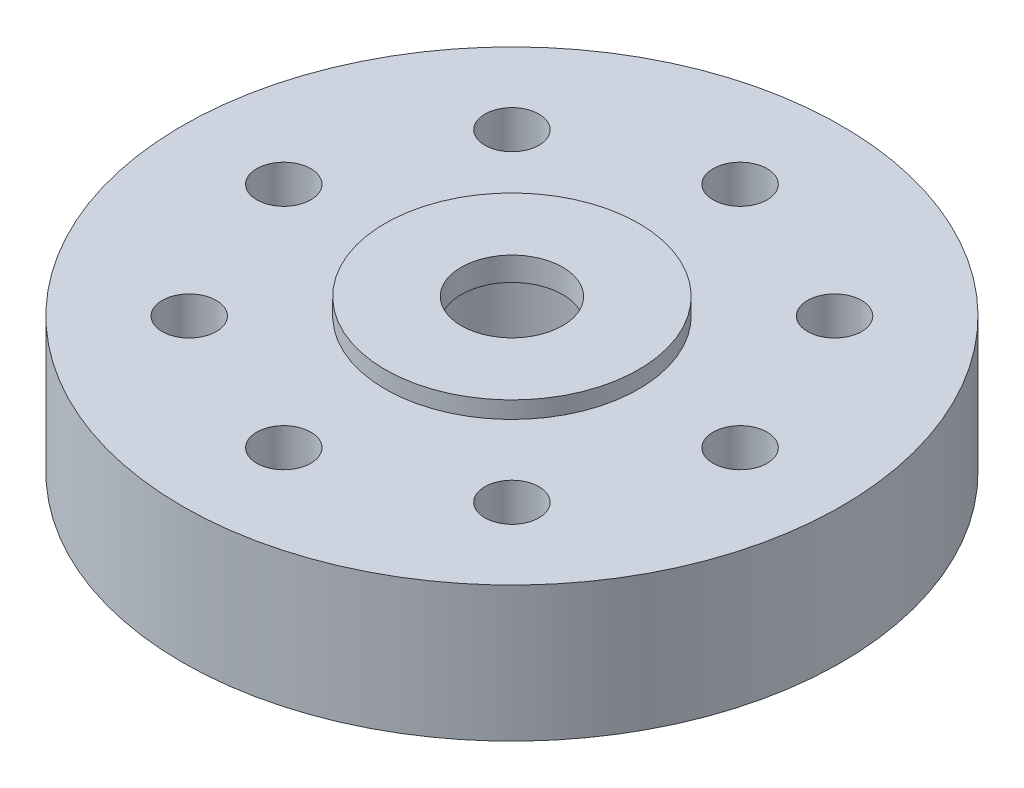
ISO-10303-21;
HEADER;
FILE_DESCRIPTION(('STEP AP214'),'2;1');
FILE_NAME('part.step','',(''),(''),'','','');
FILE_SCHEMA(('AUTOMOTIVE_DESIGN { 1 0 10303 214 1 1 1 1 }'));
ENDSEC;
DATA;
#1=APPLICATION_CONTEXT('core data for automotive mechanical design processes');
#2=APPLICATION_PROTOCOL_DEFINITION('international standard','automotive_design',2000,#1);
#3=PRODUCT_CONTEXT('',#1,'mechanical');
#4=PRODUCT('Part','Part','',(#3));
#5=PRODUCT_RELATED_PRODUCT_CATEGORY('part','',(#4));
#6=PRODUCT_DEFINITION_FORMATION('','',#4);
#7=PRODUCT_DEFINITION_CONTEXT('part definition',#1,'design');
#8=PRODUCT_DEFINITION('design','',#6,#7);
#9=PRODUCT_DEFINITION_SHAPE('','',#8);
#10=(LENGTH_UNIT() NAMED_UNIT(*) SI_UNIT(.MILLI.,.METRE.));
#11=(NAMED_UNIT(*) PLANE_ANGLE_UNIT() SI_UNIT($,.RADIAN.));
#12=(NAMED_UNIT(*) SI_UNIT($,.STERADIAN.) SOLID_ANGLE_UNIT());
#13=UNCERTAINTY_MEASURE_WITH_UNIT(LENGTH_MEASURE(1.E-05),#10,'distance_accuracy_value','');
#14=(GEOMETRIC_REPRESENTATION_CONTEXT(3) GLOBAL_UNCERTAINTY_ASSIGNED_CONTEXT((#13)) GLOBAL_UNIT_ASSIGNED_CONTEXT((#10,
#11,#12)) REPRESENTATION_CONTEXT('',''));
#15=CARTESIAN_POINT('',(0.,0.,0.));
#16=DIRECTION('',(0.,0.,1.));
#17=DIRECTION('',(1.,0.,0.));
#18=AXIS2_PLACEMENT_3D('',#15,#16,#17);
#19=CARTESIAN_POINT('',(0.,2.,0.));
#20=DIRECTION('',(0.,-1.,0.));
#21=DIRECTION('',(0.,0.,-1.));
#22=AXIS2_PLACEMENT_3D('',#19,#20,#21);
#23=CYLINDRICAL_SURFACE('',#22,1.5);
#24=CARTESIAN_POINT('',(0.,2.5,0.));
#25=DIRECTION('',(0.,1.,0.));
#26=DIRECTION('',(0.,0.,1.));
#27=AXIS2_PLACEMENT_3D('',#24,#25,#26);
#28=CIRCLE('',#27,1.5);
#29=CARTESIAN_POINT('',(0.,2.5,1.5));
#30=VERTEX_POINT('',#29);
#31=EDGE_CURVE('E252',#30,#30,#28,.T.);
#32=ORIENTED_EDGE('',*,*,#31,.T.);
#33=EDGE_LOOP('',(#32));
#34=FACE_BOUND('',#33,.T.);
#35=CARTESIAN_POINT('',(0.,1.8,0.));
#36=DIRECTION('',(0.,-1.,0.));
#37=DIRECTION('',(0.,0.,-1.));
#38=AXIS2_PLACEMENT_3D('',#35,#36,#37);
#39=CIRCLE('',#38,1.5);
#40=CARTESIAN_POINT('',(0.,1.8,-1.5));
#41=VERTEX_POINT('',#40);
#42=EDGE_CURVE('E333',#41,#41,#39,.T.);
#43=ORIENTED_EDGE('',*,*,#42,.T.);
#44=EDGE_LOOP('',(#43));
#45=FACE_BOUND('',#44,.T.);
#46=ADVANCED_FACE('F38',(#34,#45),#23,.F.);
#47=CARTESIAN_POINT('',(0.,-2.,0.));
#48=DIRECTION('',(0.,1.,0.));
#49=DIRECTION('',(0.,0.,1.));
#50=AXIS2_PLACEMENT_3D('',#47,#48,#49);
#51=PLANE('',#50);
#52=CARTESIAN_POINT('',(0.,-2.,0.));
#53=DIRECTION('',(0.,1.,0.));
#54=DIRECTION('',(0.,0.,1.));
#55=AXIS2_PLACEMENT_3D('',#52,#53,#54);
#56=CIRCLE('',#55,9.75);
#57=CARTESIAN_POINT('',(0.,-2.,9.75));
#58=VERTEX_POINT('',#57);
#59=EDGE_CURVE('E289',#58,#58,#56,.T.);
#60=ORIENTED_EDGE('',*,*,#59,.F.);
#61=EDGE_LOOP('',(#60));
#62=FACE_BOUND('',#61,.T.);
#63=CARTESIAN_POINT('',(6.75,-2.,0.));
#64=DIRECTION('',(0.,1.,0.));
#65=DIRECTION('',(0.,0.,1.));
#66=AXIS2_PLACEMENT_3D('',#63,#64,#65);
#67=CIRCLE('',#66,0.800000000000001);
#68=CARTESIAN_POINT('',(6.75,-2.,0.800000000000001));
#69=VERTEX_POINT('',#68);
#70=EDGE_CURVE('E329',#69,#69,#67,.T.);
#71=ORIENTED_EDGE('',*,*,#70,.T.);
#72=EDGE_LOOP('',(#71));
#73=FACE_BOUND('',#72,.T.);
#74=CARTESIAN_POINT('',(0.,-2.,6.75));
#75=DIRECTION('',(0.,1.,0.));
#76=DIRECTION('',(0.,0.,1.));
#77=AXIS2_PLACEMENT_3D('',#74,#75,#76);
#78=CIRCLE('',#77,0.8);
#79=CARTESIAN_POINT('',(0.,-2.,7.55));
#80=VERTEX_POINT('',#79);
#81=EDGE_CURVE('E326',#80,#80,#78,.T.);
#82=ORIENTED_EDGE('',*,*,#81,.T.);
#83=EDGE_LOOP('',(#82));
#84=FACE_BOUND('',#83,.T.);
#85=CARTESIAN_POINT('',(-6.75,-2.,0.));
#86=DIRECTION('',(0.,1.,0.));
#87=DIRECTION('',(0.,0.,1.));
#88=AXIS2_PLACEMENT_3D('',#85,#86,#87);
#89=CIRCLE('',#88,0.800000000000001);
#90=CARTESIAN_POINT('',(-6.75,-2.,0.800000000000001));
#91=VERTEX_POINT('',#90);
#92=EDGE_CURVE('E323',#91,#91,#89,.T.);
#93=ORIENTED_EDGE('',*,*,#92,.T.);
#94=EDGE_LOOP('',(#93));
#95=FACE_BOUND('',#94,.T.);
#96=CARTESIAN_POINT('',(0.,-2.,-6.75));
#97=DIRECTION('',(0.,1.,0.));
#98=DIRECTION('',(0.,0.,1.));
#99=AXIS2_PLACEMENT_3D('',#96,#97,#98);
#100=CIRCLE('',#99,0.8);
#101=CARTESIAN_POINT('',(0.,-2.,-5.95));
#102=VERTEX_POINT('',#101);
#103=EDGE_CURVE('E320',#102,#102,#100,.T.);
#104=ORIENTED_EDGE('',*,*,#103,.T.);
#105=EDGE_LOOP('',(#104));
#106=FACE_BOUND('',#105,.T.);
#107=CARTESIAN_POINT('',(4.7729707730092,-2.,4.7729707730092));
#108=DIRECTION('',(0.,1.,0.));
#109=DIRECTION('',(0.,0.,1.));
#110=AXIS2_PLACEMENT_3D('',#107,#108,#109);
#111=CIRCLE('',#110,0.800000000000001);
#112=CARTESIAN_POINT('',(4.7729707730092,-2.,5.5729707730092));
#113=VERTEX_POINT('',#112);
#114=EDGE_CURVE('E317',#113,#113,#111,.T.);
#115=ORIENTED_EDGE('',*,*,#114,.T.);
#116=EDGE_LOOP('',(#115));
#117=FACE_BOUND('',#116,.T.);
#118=CARTESIAN_POINT('',(-4.7729707730092,-2.,4.7729707730092));
#119=DIRECTION('',(0.,1.,0.));
#120=DIRECTION('',(0.,0.,1.));
#121=AXIS2_PLACEMENT_3D('',#118,#119,#120);
#122=CIRCLE('',#121,0.8);
#123=CARTESIAN_POINT('',(-4.7729707730092,-2.,5.5729707730092));
#124=VERTEX_POINT('',#123);
#125=EDGE_CURVE('E314',#124,#124,#122,.T.);
#126=ORIENTED_EDGE('',*,*,#125,.T.);
#127=EDGE_LOOP('',(#126));
#128=FACE_BOUND('',#127,.T.);
#129=CARTESIAN_POINT('',(-4.7729707730092,-2.,-4.7729707730092));
#130=DIRECTION('',(0.,1.,0.));
#131=DIRECTION('',(0.,0.,1.));
#132=AXIS2_PLACEMENT_3D('',#129,#130,#131);
#133=CIRCLE('',#132,0.8);
#134=CARTESIAN_POINT('',(-4.7729707730092,-2.,-3.97297077300919));
#135=VERTEX_POINT('',#134);
#136=EDGE_CURVE('E311',#135,#135,#133,.T.);
#137=ORIENTED_EDGE('',*,*,#136,.T.);
#138=EDGE_LOOP('',(#137));
#139=FACE_BOUND('',#138,.T.);
#140=CARTESIAN_POINT('',(4.77297077300919,-2.,-4.7729707730092));
#141=DIRECTION('',(0.,1.,0.));
#142=DIRECTION('',(0.,0.,1.));
#143=AXIS2_PLACEMENT_3D('',#140,#141,#142);
#144=CIRCLE('',#143,0.800000000000001);
#145=CARTESIAN_POINT('',(4.77297077300919,-2.,-3.9729707730092));
#146=VERTEX_POINT('',#145);
#147=EDGE_CURVE('E284',#146,#146,#144,.T.);
#148=ORIENTED_EDGE('',*,*,#147,.T.);
#149=EDGE_LOOP('',(#148));
#150=FACE_BOUND('',#149,.T.);
#151=CARTESIAN_POINT('',(4.77297077300919,-2.,4.7729707730092));
#152=DIRECTION('',(0.,-1.,0.));
#153=DIRECTION('',(0.,0.,-1.));
#154=AXIS2_PLACEMENT_3D('',#151,#152,#153);
#155=CIRCLE('',#154,2.);
#156=CARTESIAN_POINT('',(5.31331654942509,-2.,6.69859442313128));
#157=VERTEX_POINT('',#156);
#158=CARTESIAN_POINT('',(6.69859442313128,-2.,5.31331654942509));
#159=VERTEX_POINT('',#158);
#160=EDGE_CURVE('E55',#157,#159,#155,.T.);
#161=ORIENTED_EDGE('',*,*,#160,.T.);
#162=CARTESIAN_POINT('',(0.,-2.,0.));
#163=DIRECTION('',(0.,-1.,0.));
#164=DIRECTION('',(0.,0.,-1.));
#165=AXIS2_PLACEMENT_3D('',#162,#163,#164);
#166=CIRCLE('',#165,8.55);
#167=CARTESIAN_POINT('',(8.49370370370371,-2.,0.979539378325329));
#168=VERTEX_POINT('',#167);
#169=EDGE_CURVE('E226',#168,#159,#166,.T.);
#170=ORIENTED_EDGE('',*,*,#169,.F.);
#171=CARTESIAN_POINT('',(6.75,-2.,0.));
#172=DIRECTION('',(0.,-1.,0.));
#173=DIRECTION('',(0.,0.,-1.));
#174=AXIS2_PLACEMENT_3D('',#171,#172,#173);
#175=CIRCLE('',#174,2.);
#176=CARTESIAN_POINT('',(8.49370370370371,-2.,-0.979539378325329));
#177=VERTEX_POINT('',#176);
#178=EDGE_CURVE('E249',#168,#177,#175,.T.);
#179=ORIENTED_EDGE('',*,*,#178,.T.);
#180=CARTESIAN_POINT('',(6.69859442313128,-2.,-5.31331654942509));
#181=VERTEX_POINT('',#180);
#182=EDGE_CURVE('E172',#181,#177,#166,.T.);
#183=ORIENTED_EDGE('',*,*,#182,.F.);
#184=CARTESIAN_POINT('',(4.7729707730092,-2.,-4.7729707730092));
#185=DIRECTION('',(0.,-1.,0.));
#186=DIRECTION('',(0.,0.,-1.));
#187=AXIS2_PLACEMENT_3D('',#184,#185,#186);
#188=CIRCLE('',#187,2.);
#189=CARTESIAN_POINT('',(5.31331654942509,-2.,-6.69859442313128));
#190=VERTEX_POINT('',#189);
#191=EDGE_CURVE('E246',#181,#190,#188,.T.);
#192=ORIENTED_EDGE('',*,*,#191,.T.);
#193=CARTESIAN_POINT('',(0.97953937832533,-2.,-8.49370370370371));
#194=VERTEX_POINT('',#193);
#195=EDGE_CURVE('E245',#194,#190,#166,.T.);
#196=ORIENTED_EDGE('',*,*,#195,.F.);
#197=CARTESIAN_POINT('',(0.,-2.,-6.75));
#198=DIRECTION('',(0.,-1.,0.));
#199=DIRECTION('',(0.,0.,-1.));
#200=AXIS2_PLACEMENT_3D('',#197,#198,#199);
#201=CIRCLE('',#200,2.);
#202=CARTESIAN_POINT('',(-0.979539378325328,-2.,-8.49370370370371));
#203=VERTEX_POINT('',#202);
#204=EDGE_CURVE('E242',#194,#203,#201,.T.);
#205=ORIENTED_EDGE('',*,*,#204,.T.);
#206=CARTESIAN_POINT('',(-5.31331654942509,-2.,-6.69859442313128));
#207=VERTEX_POINT('',#206);
#208=EDGE_CURVE('E241',#207,#203,#166,.T.);
#209=ORIENTED_EDGE('',*,*,#208,.F.);
#210=CARTESIAN_POINT('',(-4.7729707730092,-2.,-4.7729707730092));
#211=DIRECTION('',(0.,-1.,0.));
#212=DIRECTION('',(0.,0.,-1.));
#213=AXIS2_PLACEMENT_3D('',#210,#211,#212);
#214=CIRCLE('',#213,2.);
#215=CARTESIAN_POINT('',(-6.69859442313128,-2.,-5.31331654942509));
#216=VERTEX_POINT('',#215);
#217=EDGE_CURVE('E238',#207,#216,#214,.T.);
#218=ORIENTED_EDGE('',*,*,#217,.T.);
#219=CARTESIAN_POINT('',(-8.49370370370371,-2.,-0.97953937832533));
#220=VERTEX_POINT('',#219);
#221=EDGE_CURVE('E237',#220,#216,#166,.T.);
#222=ORIENTED_EDGE('',*,*,#221,.F.);
#223=CARTESIAN_POINT('',(-6.75,-2.,0.));
#224=DIRECTION('',(0.,-1.,0.));
#225=DIRECTION('',(0.,0.,-1.));
#226=AXIS2_PLACEMENT_3D('',#223,#224,#225);
#227=CIRCLE('',#226,2.);
#228=CARTESIAN_POINT('',(-8.49370370370371,-2.,0.979539378325327));
#229=VERTEX_POINT('',#228);
#230=EDGE_CURVE('E234',#220,#229,#227,.T.);
#231=ORIENTED_EDGE('',*,*,#230,.T.);
#232=CARTESIAN_POINT('',(-6.69859442313128,-2.,5.31331654942509));
#233=VERTEX_POINT('',#232);
#234=EDGE_CURVE('E233',#233,#229,#166,.T.);
#235=ORIENTED_EDGE('',*,*,#234,.F.);
#236=CARTESIAN_POINT('',(-4.7729707730092,-2.,4.7729707730092));
#237=DIRECTION('',(0.,-1.,0.));
#238=DIRECTION('',(0.,0.,-1.));
#239=AXIS2_PLACEMENT_3D('',#236,#237,#238);
#240=CIRCLE('',#239,2.);
#241=CARTESIAN_POINT('',(-5.31331654942509,-2.,6.69859442313128));
#242=VERTEX_POINT('',#241);
#243=EDGE_CURVE('E230',#233,#242,#240,.T.);
#244=ORIENTED_EDGE('',*,*,#243,.T.);
#245=CARTESIAN_POINT('',(-0.979539378325331,-2.,8.49370370370371));
#246=VERTEX_POINT('',#245);
#247=EDGE_CURVE('E227',#246,#242,#166,.T.);
#248=ORIENTED_EDGE('',*,*,#247,.F.);
#249=CARTESIAN_POINT('',(0.,-2.,6.75));
#250=DIRECTION('',(0.,-1.,0.));
#251=DIRECTION('',(0.,0.,-1.));
#252=AXIS2_PLACEMENT_3D('',#249,#250,#251);
#253=CIRCLE('',#252,2.);
#254=CARTESIAN_POINT('',(0.979539378325327,-2.,8.49370370370371));
#255=VERTEX_POINT('',#254);
#256=EDGE_CURVE('E225',#246,#255,#253,.T.);
#257=ORIENTED_EDGE('',*,*,#256,.T.);
#258=EDGE_CURVE('E221',#157,#255,#166,.T.);
#259=ORIENTED_EDGE('',*,*,#258,.F.);
#260=EDGE_LOOP('',(#161,#170,#179,#183,#192,#196,#205,#209,#218,#222,#231,#235,#244,#248,#257,#259));
#261=FACE_BOUND('',#260,.T.);
#262=ADVANCED_FACE('F374',(#62,#73,#84,#95,#106,#117,#128,#139,#150,#261),#51,.F.);
#263=CARTESIAN_POINT('',(0.,2.,0.));
#264=DIRECTION('',(0.,-1.,0.));
#265=DIRECTION('',(0.,0.,-1.));
#266=AXIS2_PLACEMENT_3D('',#263,#264,#265);
#267=CYLINDRICAL_SURFACE('',#266,9.75);
#268=CARTESIAN_POINT('',(0.,2.,0.));
#269=DIRECTION('',(0.,1.,0.));
#270=DIRECTION('',(0.,0.,1.));
#271=AXIS2_PLACEMENT_3D('',#268,#269,#270);
#272=CIRCLE('',#271,9.75);
#273=CARTESIAN_POINT('',(0.,2.,9.75));
#274=VERTEX_POINT('',#273);
#275=EDGE_CURVE('E11',#274,#274,#272,.T.);
#276=ORIENTED_EDGE('',*,*,#275,.F.);
#277=EDGE_LOOP('',(#276));
#278=FACE_BOUND('',#277,.T.);
#279=ORIENTED_EDGE('',*,*,#59,.T.);
#280=EDGE_LOOP('',(#279));
#281=FACE_BOUND('',#280,.T.);
#282=ADVANCED_FACE('F412',(#278,#281),#267,.T.);
#283=CARTESIAN_POINT('',(6.75,2.,0.));
#284=DIRECTION('',(0.,-1.,0.));
#285=DIRECTION('',(0.,0.,-1.));
#286=AXIS2_PLACEMENT_3D('',#283,#284,#285);
#287=CYLINDRICAL_SURFACE('',#286,0.800000000000001);
#288=CARTESIAN_POINT('',(6.75,2.,0.));
#289=DIRECTION('',(0.,1.,0.));
#290=DIRECTION('',(0.,0.,1.));
#291=AXIS2_PLACEMENT_3D('',#288,#289,#290);
#292=CIRCLE('',#291,0.800000000000001);
#293=CARTESIAN_POINT('',(6.75,2.,0.800000000000001));
#294=VERTEX_POINT('',#293);
#295=EDGE_CURVE('E47',#294,#294,#292,.T.);
#296=ORIENTED_EDGE('',*,*,#295,.T.);
#297=EDGE_LOOP('',(#296));
#298=FACE_BOUND('',#297,.T.);
#299=ORIENTED_EDGE('',*,*,#70,.F.);
#300=EDGE_LOOP('',(#299));
#301=FACE_BOUND('',#300,.T.);
#302=ADVANCED_FACE('F419',(#298,#301),#287,.F.);
#303=CARTESIAN_POINT('',(0.,2.,6.75));
#304=DIRECTION('',(0.,-1.,0.));
#305=DIRECTION('',(0.,0.,-1.));
#306=AXIS2_PLACEMENT_3D('',#303,#304,#305);
#307=CYLINDRICAL_SURFACE('',#306,0.8);
#308=CARTESIAN_POINT('',(0.,2.,6.75));
#309=DIRECTION('',(0.,1.,0.));
#310=DIRECTION('',(0.,0.,1.));
#311=AXIS2_PLACEMENT_3D('',#308,#309,#310);
#312=CIRCLE('',#311,0.8);
#313=CARTESIAN_POINT('',(0.,2.,7.55));
#314=VERTEX_POINT('',#313);
#315=EDGE_CURVE('E304',#314,#314,#312,.T.);
#316=ORIENTED_EDGE('',*,*,#315,.T.);
#317=EDGE_LOOP('',(#316));
#318=FACE_BOUND('',#317,.T.);
#319=ORIENTED_EDGE('',*,*,#81,.F.);
#320=EDGE_LOOP('',(#319));
#321=FACE_BOUND('',#320,.T.);
#322=ADVANCED_FACE('F423',(#318,#321),#307,.F.);
#323=CARTESIAN_POINT('',(-6.75,2.,0.));
#324=DIRECTION('',(0.,-1.,0.));
#325=DIRECTION('',(0.,0.,-1.));
#326=AXIS2_PLACEMENT_3D('',#323,#324,#325);
#327=CYLINDRICAL_SURFACE('',#326,0.800000000000001);
#328=CARTESIAN_POINT('',(-6.75,2.,0.));
#329=DIRECTION('',(0.,1.,0.));
#330=DIRECTION('',(0.,0.,1.));
#331=AXIS2_PLACEMENT_3D('',#328,#329,#330);
#332=CIRCLE('',#331,0.800000000000001);
#333=CARTESIAN_POINT('',(-6.75,2.,0.800000000000001));
#334=VERTEX_POINT('',#333);
#335=EDGE_CURVE('E301',#334,#334,#332,.T.);
#336=ORIENTED_EDGE('',*,*,#335,.T.);
#337=EDGE_LOOP('',(#336));
#338=FACE_BOUND('',#337,.T.);
#339=ORIENTED_EDGE('',*,*,#92,.F.);
#340=EDGE_LOOP('',(#339));
#341=FACE_BOUND('',#340,.T.);
#342=ADVANCED_FACE('F427',(#338,#341),#327,.F.);
#343=CARTESIAN_POINT('',(0.,2.,-6.75));
#344=DIRECTION('',(0.,-1.,0.));
#345=DIRECTION('',(0.,0.,-1.));
#346=AXIS2_PLACEMENT_3D('',#343,#344,#345);
#347=CYLINDRICAL_SURFACE('',#346,0.8);
#348=CARTESIAN_POINT('',(0.,2.,-6.75));
#349=DIRECTION('',(0.,1.,0.));
#350=DIRECTION('',(0.,0.,1.));
#351=AXIS2_PLACEMENT_3D('',#348,#349,#350);
#352=CIRCLE('',#351,0.8);
#353=CARTESIAN_POINT('',(0.,2.,-5.95));
#354=VERTEX_POINT('',#353);
#355=EDGE_CURVE('E298',#354,#354,#352,.T.);
#356=ORIENTED_EDGE('',*,*,#355,.T.);
#357=EDGE_LOOP('',(#356));
#358=FACE_BOUND('',#357,.T.);
#359=ORIENTED_EDGE('',*,*,#103,.F.);
#360=EDGE_LOOP('',(#359));
#361=FACE_BOUND('',#360,.T.);
#362=ADVANCED_FACE('F431',(#358,#361),#347,.F.);
#363=CARTESIAN_POINT('',(4.7729707730092,2.,4.7729707730092));
#364=DIRECTION('',(0.,-1.,0.));
#365=DIRECTION('',(0.,0.,-1.));
#366=AXIS2_PLACEMENT_3D('',#363,#364,#365);
#367=CYLINDRICAL_SURFACE('',#366,0.800000000000001);
#368=CARTESIAN_POINT('',(4.7729707730092,2.,4.7729707730092));
#369=DIRECTION('',(0.,1.,0.));
#370=DIRECTION('',(0.,0.,1.));
#371=AXIS2_PLACEMENT_3D('',#368,#369,#370);
#372=CIRCLE('',#371,0.800000000000001);
#373=CARTESIAN_POINT('',(4.7729707730092,2.,5.5729707730092));
#374=VERTEX_POINT('',#373);
#375=EDGE_CURVE('E295',#374,#374,#372,.T.);
#376=ORIENTED_EDGE('',*,*,#375,.T.);
#377=EDGE_LOOP('',(#376));
#378=FACE_BOUND('',#377,.T.);
#379=ORIENTED_EDGE('',*,*,#114,.F.);
#380=EDGE_LOOP('',(#379));
#381=FACE_BOUND('',#380,.T.);
#382=ADVANCED_FACE('F435',(#378,#381),#367,.F.);
#383=CARTESIAN_POINT('',(-4.7729707730092,2.,4.7729707730092));
#384=DIRECTION('',(0.,-1.,0.));
#385=DIRECTION('',(0.,0.,-1.));
#386=AXIS2_PLACEMENT_3D('',#383,#384,#385);
#387=CYLINDRICAL_SURFACE('',#386,0.8);
#388=CARTESIAN_POINT('',(-4.7729707730092,2.,4.7729707730092));
#389=DIRECTION('',(0.,1.,0.));
#390=DIRECTION('',(0.,0.,1.));
#391=AXIS2_PLACEMENT_3D('',#388,#389,#390);
#392=CIRCLE('',#391,0.8);
#393=CARTESIAN_POINT('',(-4.7729707730092,2.,5.5729707730092));
#394=VERTEX_POINT('',#393);
#395=EDGE_CURVE('E292',#394,#394,#392,.T.);
#396=ORIENTED_EDGE('',*,*,#395,.T.);
#397=EDGE_LOOP('',(#396));
#398=FACE_BOUND('',#397,.T.);
#399=ORIENTED_EDGE('',*,*,#125,.F.);
#400=EDGE_LOOP('',(#399));
#401=FACE_BOUND('',#400,.T.);
#402=ADVANCED_FACE('F439',(#398,#401),#387,.F.);
#403=CARTESIAN_POINT('',(-4.7729707730092,2.,-4.7729707730092));
#404=DIRECTION('',(0.,-1.,0.));
#405=DIRECTION('',(0.,0.,-1.));
#406=AXIS2_PLACEMENT_3D('',#403,#404,#405);
#407=CYLINDRICAL_SURFACE('',#406,0.8);
#408=CARTESIAN_POINT('',(-4.7729707730092,2.,-4.7729707730092));
#409=DIRECTION('',(0.,1.,0.));
#410=DIRECTION('',(0.,0.,1.));
#411=AXIS2_PLACEMENT_3D('',#408,#409,#410);
#412=CIRCLE('',#411,0.8);
#413=CARTESIAN_POINT('',(-4.7729707730092,2.,-3.97297077300919));
#414=VERTEX_POINT('',#413);
#415=EDGE_CURVE('E288',#414,#414,#412,.T.);
#416=ORIENTED_EDGE('',*,*,#415,.T.);
#417=EDGE_LOOP('',(#416));
#418=FACE_BOUND('',#417,.T.);
#419=ORIENTED_EDGE('',*,*,#136,.F.);
#420=EDGE_LOOP('',(#419));
#421=FACE_BOUND('',#420,.T.);
#422=ADVANCED_FACE('F442',(#418,#421),#407,.F.);
#423=CARTESIAN_POINT('',(4.77297077300919,2.,-4.7729707730092));
#424=DIRECTION('',(0.,-1.,0.));
#425=DIRECTION('',(0.,0.,-1.));
#426=AXIS2_PLACEMENT_3D('',#423,#424,#425);
#427=CYLINDRICAL_SURFACE('',#426,0.800000000000001);
#428=CARTESIAN_POINT('',(4.77297077300919,2.,-4.7729707730092));
#429=DIRECTION('',(0.,1.,0.));
#430=DIRECTION('',(0.,0.,1.));
#431=AXIS2_PLACEMENT_3D('',#428,#429,#430);
#432=CIRCLE('',#431,0.800000000000001);
#433=CARTESIAN_POINT('',(4.77297077300919,2.,-3.9729707730092));
#434=VERTEX_POINT('',#433);
#435=EDGE_CURVE('E285',#434,#434,#432,.T.);
#436=ORIENTED_EDGE('',*,*,#435,.T.);
#437=EDGE_LOOP('',(#436));
#438=FACE_BOUND('',#437,.T.);
#439=ORIENTED_EDGE('',*,*,#147,.F.);
#440=EDGE_LOOP('',(#439));
#441=FACE_BOUND('',#440,.T.);
#442=ADVANCED_FACE('F40',(#438,#441),#427,.F.);
#443=CARTESIAN_POINT('',(0.,2.,0.));
#444=DIRECTION('',(0.,1.,0.));
#445=DIRECTION('',(0.,0.,1.));
#446=AXIS2_PLACEMENT_3D('',#443,#444,#445);
#447=PLANE('',#446);
#448=CARTESIAN_POINT('',(0.,2.,0.));
#449=DIRECTION('',(0.,1.,0.));
#450=DIRECTION('',(0.,0.,1.));
#451=AXIS2_PLACEMENT_3D('',#448,#449,#450);
#452=CIRCLE('',#451,3.75);
#453=CARTESIAN_POINT('',(0.,2.,3.75));
#454=VERTEX_POINT('',#453);
#455=EDGE_CURVE('E281',#454,#454,#452,.F.);
#456=ORIENTED_EDGE('',*,*,#455,.T.);
#457=EDGE_LOOP('',(#456));
#458=FACE_BOUND('',#457,.T.);
#459=ORIENTED_EDGE('',*,*,#435,.F.);
#460=EDGE_LOOP('',(#459));
#461=FACE_BOUND('',#460,.T.);
#462=ORIENTED_EDGE('',*,*,#415,.F.);
#463=EDGE_LOOP('',(#462));
#464=FACE_BOUND('',#463,.T.);
#465=ORIENTED_EDGE('',*,*,#395,.F.);
#466=EDGE_LOOP('',(#465));
#467=FACE_BOUND('',#466,.T.);
#468=ORIENTED_EDGE('',*,*,#375,.F.);
#469=EDGE_LOOP('',(#468));
#470=FACE_BOUND('',#469,.T.);
#471=ORIENTED_EDGE('',*,*,#355,.F.);
#472=EDGE_LOOP('',(#471));
#473=FACE_BOUND('',#472,.T.);
#474=ORIENTED_EDGE('',*,*,#335,.F.);
#475=EDGE_LOOP('',(#474));
#476=FACE_BOUND('',#475,.T.);
#477=ORIENTED_EDGE('',*,*,#315,.F.);
#478=EDGE_LOOP('',(#477));
#479=FACE_BOUND('',#478,.T.);
#480=ORIENTED_EDGE('',*,*,#295,.F.);
#481=EDGE_LOOP('',(#480));
#482=FACE_BOUND('',#481,.T.);
#483=ORIENTED_EDGE('',*,*,#275,.T.);
#484=EDGE_LOOP('',(#483));
#485=FACE_BOUND('',#484,.T.);
#486=ADVANCED_FACE('F449',(#458,#461,#464,#467,#470,#473,#476,#479,#482,#485),#447,.T.);
#487=CARTESIAN_POINT('',(0.,-2.5,0.));
#488=DIRECTION('',(0.,1.,0.));
#489=DIRECTION('',(0.,0.,1.));
#490=AXIS2_PLACEMENT_3D('',#487,#488,#489);
#491=PLANE('',#490);
#492=CARTESIAN_POINT('',(0.,-2.5,0.));
#493=DIRECTION('',(0.,1.,0.));
#494=DIRECTION('',(0.,0.,1.));
#495=AXIS2_PLACEMENT_3D('',#492,#493,#494);
#496=CIRCLE('',#495,2.5);
#497=CARTESIAN_POINT('',(0.,-2.5,-2.5));
#498=VERTEX_POINT('',#497);
#499=EDGE_CURVE('E42',#498,#498,#496,.T.);
#500=ORIENTED_EDGE('',*,*,#499,.T.);
#501=EDGE_LOOP('',(#500));
#502=FACE_BOUND('',#501,.T.);
#503=CARTESIAN_POINT('',(0.,-2.5,0.));
#504=DIRECTION('',(0.,-1.,0.));
#505=DIRECTION('',(0.,0.,-1.));
#506=AXIS2_PLACEMENT_3D('',#503,#504,#505);
#507=CIRCLE('',#506,4.4);
#508=CARTESIAN_POINT('',(0.,-2.5,-4.4));
#509=VERTEX_POINT('',#508);
#510=EDGE_CURVE('E222',#509,#509,#507,.T.);
#511=ORIENTED_EDGE('',*,*,#510,.T.);
#512=EDGE_LOOP('',(#511));
#513=FACE_BOUND('',#512,.T.);
#514=ADVANCED_FACE('F461',(#502,#513),#491,.F.);
#515=CARTESIAN_POINT('',(0.,2.5,0.));
#516=DIRECTION('',(0.,-1.,0.));
#517=DIRECTION('',(0.,0.,-1.));
#518=AXIS2_PLACEMENT_3D('',#515,#516,#517);
#519=CYLINDRICAL_SURFACE('',#518,3.75);
#520=ORIENTED_EDGE('',*,*,#455,.F.);
#521=EDGE_LOOP('',(#520));
#522=FACE_BOUND('',#521,.T.);
#523=CARTESIAN_POINT('',(0.,2.5,0.));
#524=DIRECTION('',(0.,1.,0.));
#525=DIRECTION('',(0.,0.,1.));
#526=AXIS2_PLACEMENT_3D('',#523,#524,#525);
#527=CIRCLE('',#526,3.75);
#528=CARTESIAN_POINT('',(0.,2.5,3.75));
#529=VERTEX_POINT('',#528);
#530=EDGE_CURVE('E278',#529,#529,#527,.T.);
#531=ORIENTED_EDGE('',*,*,#530,.F.);
#532=EDGE_LOOP('',(#531));
#533=FACE_BOUND('',#532,.T.);
#534=ADVANCED_FACE('F499',(#522,#533),#519,.T.);
#535=CARTESIAN_POINT('',(0.,2.5,0.));
#536=DIRECTION('',(0.,1.,0.));
#537=DIRECTION('',(0.,0.,1.));
#538=AXIS2_PLACEMENT_3D('',#535,#536,#537);
#539=PLANE('',#538);
#540=ORIENTED_EDGE('',*,*,#31,.F.);
#541=EDGE_LOOP('',(#540));
#542=FACE_BOUND('',#541,.T.);
#543=ORIENTED_EDGE('',*,*,#530,.T.);
#544=EDGE_LOOP('',(#543));
#545=FACE_BOUND('',#544,.T.);
#546=ADVANCED_FACE('F505',(#542,#545),#539,.T.);
#547=CARTESIAN_POINT('',(4.77297077300919,1.8,4.7729707730092));
#548=DIRECTION('',(0.,-1.,0.));
#549=DIRECTION('',(0.,0.,-1.));
#550=AXIS2_PLACEMENT_3D('',#547,#548,#549);
#551=CYLINDRICAL_SURFACE('',#550,2.);
#552=ORIENTED_EDGE('',*,*,#160,.F.);
#553=DIRECTION('',(0.,-1.,0.));
#554=VECTOR('',#553,1.);
#555=CARTESIAN_POINT('',(5.31331654942509,1.8,6.69859442313128));
#556=LINE('',#555,#554);
#557=CARTESIAN_POINT('',(5.31331654942509,1.8,6.69859442313128));
#558=VERTEX_POINT('',#557);
#559=EDGE_CURVE('E115',#558,#157,#556,.T.);
#560=ORIENTED_EDGE('',*,*,#559,.F.);
#561=CARTESIAN_POINT('',(4.77297077300919,1.8,4.7729707730092));
#562=DIRECTION('',(0.,-1.,0.));
#563=DIRECTION('',(0.,0.,-1.));
#564=AXIS2_PLACEMENT_3D('',#561,#562,#563);
#565=CIRCLE('',#564,2.);
#566=CARTESIAN_POINT('',(6.69859442313128,1.8,5.31331654942509));
#567=VERTEX_POINT('',#566);
#568=EDGE_CURVE('E61',#558,#567,#565,.T.);
#569=ORIENTED_EDGE('',*,*,#568,.T.);
#570=DIRECTION('',(0.,-1.,0.));
#571=VECTOR('',#570,1.);
#572=CARTESIAN_POINT('',(6.69859442313128,1.8,5.31331654942509));
#573=LINE('',#572,#571);
#574=EDGE_CURVE('E111',#567,#159,#573,.T.);
#575=ORIENTED_EDGE('',*,*,#574,.T.);
#576=EDGE_LOOP('',(#552,#560,#569,#575));
#577=FACE_BOUND('',#576,.T.);
#578=ADVANCED_FACE('F510',(#577),#551,.T.);
#579=CARTESIAN_POINT('',(0.,1.8,0.));
#580=DIRECTION('',(0.,-1.,0.));
#581=DIRECTION('',(0.,0.,-1.));
#582=AXIS2_PLACEMENT_3D('',#579,#580,#581);
#583=CYLINDRICAL_SURFACE('',#582,8.55);
#584=ORIENTED_EDGE('',*,*,#169,.T.);
#585=ORIENTED_EDGE('',*,*,#574,.F.);
#586=CARTESIAN_POINT('',(0.,1.8,0.));
#587=DIRECTION('',(0.,-1.,0.));
#588=DIRECTION('',(0.,0.,-1.));
#589=AXIS2_PLACEMENT_3D('',#586,#587,#588);
#590=CIRCLE('',#589,8.55);
#591=CARTESIAN_POINT('',(8.49370370370371,1.8,0.979539378325329));
#592=VERTEX_POINT('',#591);
#593=EDGE_CURVE('E165',#592,#567,#590,.T.);
#594=ORIENTED_EDGE('',*,*,#593,.F.);
#595=DIRECTION('',(0.,-1.,0.));
#596=VECTOR('',#595,1.);
#597=CARTESIAN_POINT('',(8.49370370370371,1.8,0.979539378325329));
#598=LINE('',#597,#596);
#599=EDGE_CURVE('E160',#592,#168,#598,.T.);
#600=ORIENTED_EDGE('',*,*,#599,.T.);
#601=EDGE_LOOP('',(#584,#585,#594,#600));
#602=FACE_BOUND('',#601,.T.);
#603=ADVANCED_FACE('F401',(#602),#583,.F.);
#604=CARTESIAN_POINT('',(6.75,1.8,0.));
#605=DIRECTION('',(0.,-1.,0.));
#606=DIRECTION('',(0.,0.,-1.));
#607=AXIS2_PLACEMENT_3D('',#604,#605,#606);
#608=CYLINDRICAL_SURFACE('',#607,2.);
#609=ORIENTED_EDGE('',*,*,#178,.F.);
#610=ORIENTED_EDGE('',*,*,#599,.F.);
#611=CARTESIAN_POINT('',(6.75,1.8,0.));
#612=DIRECTION('',(0.,-1.,0.));
#613=DIRECTION('',(0.,0.,-1.));
#614=AXIS2_PLACEMENT_3D('',#611,#612,#613);
#615=CIRCLE('',#614,2.);
#616=CARTESIAN_POINT('',(8.49370370370371,1.8,-0.979539378325329));
#617=VERTEX_POINT('',#616);
#618=EDGE_CURVE('E154',#592,#617,#615,.T.);
#619=ORIENTED_EDGE('',*,*,#618,.T.);
#620=DIRECTION('',(0.,-1.,0.));
#621=VECTOR('',#620,1.);
#622=CARTESIAN_POINT('',(8.49370370370371,1.8,-0.979539378325329));
#623=LINE('',#622,#621);
#624=EDGE_CURVE('E158',#617,#177,#623,.T.);
#625=ORIENTED_EDGE('',*,*,#624,.T.);
#626=EDGE_LOOP('',(#609,#610,#619,#625));
#627=FACE_BOUND('',#626,.T.);
#628=ADVANCED_FACE('F157',(#627),#608,.T.);
#629=ORIENTED_EDGE('',*,*,#182,.T.);
#630=ORIENTED_EDGE('',*,*,#624,.F.);
#631=CARTESIAN_POINT('',(6.69859442313128,1.8,-5.31331654942509));
#632=VERTEX_POINT('',#631);
#633=EDGE_CURVE('E166',#632,#617,#590,.T.);
#634=ORIENTED_EDGE('',*,*,#633,.F.);
#635=DIRECTION('',(0.,-1.,0.));
#636=VECTOR('',#635,1.);
#637=CARTESIAN_POINT('',(6.69859442313128,1.8,-5.31331654942509));
#638=LINE('',#637,#636);
#639=EDGE_CURVE('E174',#632,#181,#638,.T.);
#640=ORIENTED_EDGE('',*,*,#639,.T.);
#641=EDGE_LOOP('',(#629,#630,#634,#640));
#642=FACE_BOUND('',#641,.T.);
#643=ADVANCED_FACE('F170',(#642),#583,.F.);
#644=CARTESIAN_POINT('',(4.7729707730092,1.8,-4.7729707730092));
#645=DIRECTION('',(0.,-1.,0.));
#646=DIRECTION('',(0.,0.,-1.));
#647=AXIS2_PLACEMENT_3D('',#644,#645,#646);
#648=CYLINDRICAL_SURFACE('',#647,2.);
#649=ORIENTED_EDGE('',*,*,#191,.F.);
#650=ORIENTED_EDGE('',*,*,#639,.F.);
#651=CARTESIAN_POINT('',(4.7729707730092,1.8,-4.7729707730092));
#652=DIRECTION('',(0.,-1.,0.));
#653=DIRECTION('',(0.,0.,-1.));
#654=AXIS2_PLACEMENT_3D('',#651,#652,#653);
#655=CIRCLE('',#654,2.);
#656=CARTESIAN_POINT('',(5.31331654942509,1.8,-6.69859442313128));
#657=VERTEX_POINT('',#656);
#658=EDGE_CURVE('E179',#632,#657,#655,.T.);
#659=ORIENTED_EDGE('',*,*,#658,.T.);
#660=DIRECTION('',(0.,-1.,0.));
#661=VECTOR('',#660,1.);
#662=CARTESIAN_POINT('',(5.31331654942509,1.8,-6.69859442313128));
#663=LINE('',#662,#661);
#664=EDGE_CURVE('E255',#657,#190,#663,.T.);
#665=ORIENTED_EDGE('',*,*,#664,.T.);
#666=EDGE_LOOP('',(#649,#650,#659,#665));
#667=FACE_BOUND('',#666,.T.);
#668=ADVANCED_FACE('F390',(#667),#648,.T.);
#669=ORIENTED_EDGE('',*,*,#195,.T.);
#670=ORIENTED_EDGE('',*,*,#664,.F.);
#671=CARTESIAN_POINT('',(0.97953937832533,1.8,-8.49370370370371));
#672=VERTEX_POINT('',#671);
#673=EDGE_CURVE('E181',#672,#657,#590,.T.);
#674=ORIENTED_EDGE('',*,*,#673,.F.);
#675=DIRECTION('',(0.,-1.,0.));
#676=VECTOR('',#675,1.);
#677=CARTESIAN_POINT('',(0.97953937832533,1.8,-8.49370370370371));
#678=LINE('',#677,#676);
#679=EDGE_CURVE('E257',#672,#194,#678,.T.);
#680=ORIENTED_EDGE('',*,*,#679,.T.);
#681=EDGE_LOOP('',(#669,#670,#674,#680));
#682=FACE_BOUND('',#681,.T.);
#683=ADVANCED_FACE('F392',(#682),#583,.F.);
#684=CARTESIAN_POINT('',(0.,1.8,-6.75));
#685=DIRECTION('',(0.,-1.,0.));
#686=DIRECTION('',(0.,0.,-1.));
#687=AXIS2_PLACEMENT_3D('',#684,#685,#686);
#688=CYLINDRICAL_SURFACE('',#687,2.);
#689=ORIENTED_EDGE('',*,*,#204,.F.);
#690=ORIENTED_EDGE('',*,*,#679,.F.);
#691=CARTESIAN_POINT('',(0.,1.8,-6.75));
#692=DIRECTION('',(0.,-1.,0.));
#693=DIRECTION('',(0.,0.,-1.));
#694=AXIS2_PLACEMENT_3D('',#691,#692,#693);
#695=CIRCLE('',#694,2.);
#696=CARTESIAN_POINT('',(-0.979539378325328,1.8,-8.49370370370371));
#697=VERTEX_POINT('',#696);
#698=EDGE_CURVE('E186',#672,#697,#695,.T.);
#699=ORIENTED_EDGE('',*,*,#698,.T.);
#700=DIRECTION('',(0.,-1.,0.));
#701=VECTOR('',#700,1.);
#702=CARTESIAN_POINT('',(-0.979539378325328,1.8,-8.49370370370371));
#703=LINE('',#702,#701);
#704=EDGE_CURVE('E259',#697,#203,#703,.T.);
#705=ORIENTED_EDGE('',*,*,#704,.T.);
#706=EDGE_LOOP('',(#689,#690,#699,#705));
#707=FACE_BOUND('',#706,.T.);
#708=ADVANCED_FACE('F387',(#707),#688,.T.);
#709=ORIENTED_EDGE('',*,*,#208,.T.);
#710=ORIENTED_EDGE('',*,*,#704,.F.);
#711=CARTESIAN_POINT('',(-5.31331654942509,1.8,-6.69859442313128));
#712=VERTEX_POINT('',#711);
#713=EDGE_CURVE('E187',#712,#697,#590,.T.);
#714=ORIENTED_EDGE('',*,*,#713,.F.);
#715=DIRECTION('',(0.,-1.,0.));
#716=VECTOR('',#715,1.);
#717=CARTESIAN_POINT('',(-5.31331654942509,1.8,-6.69859442313128));
#718=LINE('',#717,#716);
#719=EDGE_CURVE('E261',#712,#207,#718,.T.);
#720=ORIENTED_EDGE('',*,*,#719,.T.);
#721=EDGE_LOOP('',(#709,#710,#714,#720));
#722=FACE_BOUND('',#721,.T.);
#723=ADVANCED_FACE('F385',(#722),#583,.F.);
#724=CARTESIAN_POINT('',(-4.7729707730092,1.8,-4.7729707730092));
#725=DIRECTION('',(0.,-1.,0.));
#726=DIRECTION('',(0.,0.,-1.));
#727=AXIS2_PLACEMENT_3D('',#724,#725,#726);
#728=CYLINDRICAL_SURFACE('',#727,2.);
#729=ORIENTED_EDGE('',*,*,#217,.F.);
#730=ORIENTED_EDGE('',*,*,#719,.F.);
#731=CARTESIAN_POINT('',(-4.7729707730092,1.8,-4.7729707730092));
#732=DIRECTION('',(0.,-1.,0.));
#733=DIRECTION('',(0.,0.,-1.));
#734=AXIS2_PLACEMENT_3D('',#731,#732,#733);
#735=CIRCLE('',#734,2.);
#736=CARTESIAN_POINT('',(-6.69859442313128,1.8,-5.31331654942509));
#737=VERTEX_POINT('',#736);
#738=EDGE_CURVE('E209',#712,#737,#735,.T.);
#739=ORIENTED_EDGE('',*,*,#738,.T.);
#740=DIRECTION('',(0.,-1.,0.));
#741=VECTOR('',#740,1.);
#742=CARTESIAN_POINT('',(-6.69859442313128,1.8,-5.31331654942509));
#743=LINE('',#742,#741);
#744=EDGE_CURVE('E263',#737,#216,#743,.T.);
#745=ORIENTED_EDGE('',*,*,#744,.T.);
#746=EDGE_LOOP('',(#729,#730,#739,#745));
#747=FACE_BOUND('',#746,.T.);
#748=ADVANCED_FACE('F384',(#747),#728,.T.);
#749=ORIENTED_EDGE('',*,*,#221,.T.);
#750=ORIENTED_EDGE('',*,*,#744,.F.);
#751=CARTESIAN_POINT('',(-8.49370370370371,1.8,-0.97953937832533));
#752=VERTEX_POINT('',#751);
#753=EDGE_CURVE('E204',#752,#737,#590,.T.);
#754=ORIENTED_EDGE('',*,*,#753,.F.);
#755=DIRECTION('',(0.,-1.,0.));
#756=VECTOR('',#755,1.);
#757=CARTESIAN_POINT('',(-8.49370370370371,1.8,-0.97953937832533));
#758=LINE('',#757,#756);
#759=EDGE_CURVE('E265',#752,#220,#758,.T.);
#760=ORIENTED_EDGE('',*,*,#759,.T.);
#761=EDGE_LOOP('',(#749,#750,#754,#760));
#762=FACE_BOUND('',#761,.T.);
#763=ADVANCED_FACE('F381',(#762),#583,.F.);
#764=CARTESIAN_POINT('',(-6.75,1.8,0.));
#765=DIRECTION('',(0.,-1.,0.));
#766=DIRECTION('',(0.,0.,-1.));
#767=AXIS2_PLACEMENT_3D('',#764,#765,#766);
#768=CYLINDRICAL_SURFACE('',#767,2.);
#769=ORIENTED_EDGE('',*,*,#230,.F.);
#770=ORIENTED_EDGE('',*,*,#759,.F.);
#771=CARTESIAN_POINT('',(-6.75,1.8,0.));
#772=DIRECTION('',(0.,-1.,0.));
#773=DIRECTION('',(0.,0.,-1.));
#774=AXIS2_PLACEMENT_3D('',#771,#772,#773);
#775=CIRCLE('',#774,2.);
#776=CARTESIAN_POINT('',(-8.49370370370371,1.8,0.979539378325327));
#777=VERTEX_POINT('',#776);
#778=EDGE_CURVE('E203',#752,#777,#775,.T.);
#779=ORIENTED_EDGE('',*,*,#778,.T.);
#780=DIRECTION('',(0.,-1.,0.));
#781=VECTOR('',#780,1.);
#782=CARTESIAN_POINT('',(-8.49370370370371,1.8,0.979539378325327));
#783=LINE('',#782,#781);
#784=EDGE_CURVE('E267',#777,#229,#783,.T.);
#785=ORIENTED_EDGE('',*,*,#784,.T.);
#786=EDGE_LOOP('',(#769,#770,#779,#785));
#787=FACE_BOUND('',#786,.T.);
#788=ADVANCED_FACE('F380',(#787),#768,.T.);
#789=ORIENTED_EDGE('',*,*,#234,.T.);
#790=ORIENTED_EDGE('',*,*,#784,.F.);
#791=CARTESIAN_POINT('',(-6.69859442313128,1.8,5.31331654942509));
#792=VERTEX_POINT('',#791);
#793=EDGE_CURVE('E198',#792,#777,#590,.T.);
#794=ORIENTED_EDGE('',*,*,#793,.F.);
#795=DIRECTION('',(0.,-1.,0.));
#796=VECTOR('',#795,1.);
#797=CARTESIAN_POINT('',(-6.69859442313128,1.8,5.31331654942509));
#798=LINE('',#797,#796);
#799=EDGE_CURVE('E269',#792,#233,#798,.T.);
#800=ORIENTED_EDGE('',*,*,#799,.T.);
#801=EDGE_LOOP('',(#789,#790,#794,#800));
#802=FACE_BOUND('',#801,.T.);
#803=ADVANCED_FACE('F377',(#802),#583,.F.);
#804=CARTESIAN_POINT('',(-4.7729707730092,1.8,4.7729707730092));
#805=DIRECTION('',(0.,-1.,0.));
#806=DIRECTION('',(0.,0.,-1.));
#807=AXIS2_PLACEMENT_3D('',#804,#805,#806);
#808=CYLINDRICAL_SURFACE('',#807,2.);
#809=ORIENTED_EDGE('',*,*,#243,.F.);
#810=ORIENTED_EDGE('',*,*,#799,.F.);
#811=CARTESIAN_POINT('',(-4.7729707730092,1.8,4.7729707730092));
#812=DIRECTION('',(0.,-1.,0.));
#813=DIRECTION('',(0.,0.,-1.));
#814=AXIS2_PLACEMENT_3D('',#811,#812,#813);
#815=CIRCLE('',#814,2.);
#816=CARTESIAN_POINT('',(-5.31331654942509,1.8,6.69859442313128));
#817=VERTEX_POINT('',#816);
#818=EDGE_CURVE('E197',#792,#817,#815,.T.);
#819=ORIENTED_EDGE('',*,*,#818,.T.);
#820=DIRECTION('',(0.,-1.,0.));
#821=VECTOR('',#820,1.);
#822=CARTESIAN_POINT('',(-5.31331654942509,1.8,6.69859442313128));
#823=LINE('',#822,#821);
#824=EDGE_CURVE('E271',#817,#242,#823,.T.);
#825=ORIENTED_EDGE('',*,*,#824,.T.);
#826=EDGE_LOOP('',(#809,#810,#819,#825));
#827=FACE_BOUND('',#826,.T.);
#828=ADVANCED_FACE('F376',(#827),#808,.T.);
#829=ORIENTED_EDGE('',*,*,#247,.T.);
#830=ORIENTED_EDGE('',*,*,#824,.F.);
#831=CARTESIAN_POINT('',(-0.979539378325331,1.8,8.49370370370371));
#832=VERTEX_POINT('',#831);
#833=EDGE_CURVE('E192',#832,#817,#590,.T.);
#834=ORIENTED_EDGE('',*,*,#833,.F.);
#835=DIRECTION('',(0.,-1.,0.));
#836=VECTOR('',#835,1.);
#837=CARTESIAN_POINT('',(-0.979539378325331,1.8,8.49370370370371));
#838=LINE('',#837,#836);
#839=EDGE_CURVE('E273',#832,#246,#838,.T.);
#840=ORIENTED_EDGE('',*,*,#839,.T.);
#841=EDGE_LOOP('',(#829,#830,#834,#840));
#842=FACE_BOUND('',#841,.T.);
#843=ADVANCED_FACE('F370',(#842),#583,.F.);
#844=CARTESIAN_POINT('',(0.,1.8,6.75));
#845=DIRECTION('',(0.,-1.,0.));
#846=DIRECTION('',(0.,0.,-1.));
#847=AXIS2_PLACEMENT_3D('',#844,#845,#846);
#848=CYLINDRICAL_SURFACE('',#847,2.);
#849=ORIENTED_EDGE('',*,*,#256,.F.);
#850=ORIENTED_EDGE('',*,*,#839,.F.);
#851=CARTESIAN_POINT('',(0.,1.8,6.75));
#852=DIRECTION('',(0.,-1.,0.));
#853=DIRECTION('',(0.,0.,-1.));
#854=AXIS2_PLACEMENT_3D('',#851,#852,#853);
#855=CIRCLE('',#854,2.);
#856=CARTESIAN_POINT('',(0.979539378325327,1.8,8.49370370370371));
#857=VERTEX_POINT('',#856);
#858=EDGE_CURVE('E191',#832,#857,#855,.T.);
#859=ORIENTED_EDGE('',*,*,#858,.T.);
#860=DIRECTION('',(0.,-1.,0.));
#861=VECTOR('',#860,1.);
#862=CARTESIAN_POINT('',(0.979539378325327,1.8,8.49370370370371));
#863=LINE('',#862,#861);
#864=EDGE_CURVE('E188',#857,#255,#863,.T.);
#865=ORIENTED_EDGE('',*,*,#864,.T.);
#866=EDGE_LOOP('',(#849,#850,#859,#865));
#867=FACE_BOUND('',#866,.T.);
#868=ADVANCED_FACE('F516',(#867),#848,.T.);
#869=CARTESIAN_POINT('',(0.,1.8,0.));
#870=DIRECTION('',(0.,-1.,0.));
#871=DIRECTION('',(0.,0.,-1.));
#872=AXIS2_PLACEMENT_3D('',#869,#870,#871);
#873=CYLINDRICAL_SURFACE('',#872,4.4);
#874=CARTESIAN_POINT('',(0.,1.8,0.));
#875=DIRECTION('',(0.,-1.,0.));
#876=DIRECTION('',(0.,0.,-1.));
#877=AXIS2_PLACEMENT_3D('',#874,#875,#876);
#878=CIRCLE('',#877,4.4);
#879=CARTESIAN_POINT('',(0.,1.8,-4.4));
#880=VERTEX_POINT('',#879);
#881=EDGE_CURVE('E195',#880,#880,#878,.T.);
#882=CARTESIAN_POINT('',(0.,1.8,-4.4));
#883=CARTESIAN_POINT('',(0.,1.75520833333333,-4.4));
#884=CARTESIAN_POINT('',(0.,1.71041666666667,-4.4));
#885=CARTESIAN_POINT('',(0.,1.62083333333333,-4.4));
#886=CARTESIAN_POINT('',(0.,1.57604166666667,-4.4));
#887=CARTESIAN_POINT('',(0.,1.48645833333333,-4.4));
#888=CARTESIAN_POINT('',(0.,1.44166666666667,-4.4));
#889=CARTESIAN_POINT('',(0.,1.35208333333333,-4.4));
#890=CARTESIAN_POINT('',(0.,1.30729166666667,-4.4));
#891=CARTESIAN_POINT('',(0.,1.21770833333333,-4.4));
#892=CARTESIAN_POINT('',(0.,1.17291666666667,-4.4));
#893=CARTESIAN_POINT('',(0.,1.08333333333333,-4.4));
#894=CARTESIAN_POINT('',(0.,1.03854166666667,-4.4));
#895=CARTESIAN_POINT('',(0.,0.948958333333334,-4.4));
#896=CARTESIAN_POINT('',(0.,0.904166666666667,-4.4));
#897=CARTESIAN_POINT('',(0.,0.814583333333334,-4.4));
#898=CARTESIAN_POINT('',(0.,0.769791666666667,-4.4));
#899=CARTESIAN_POINT('',(0.,0.680208333333334,-4.4));
#900=CARTESIAN_POINT('',(0.,0.635416666666667,-4.4));
#901=CARTESIAN_POINT('',(0.,0.545833333333334,-4.4));
#902=CARTESIAN_POINT('',(0.,0.501041666666667,-4.4));
#903=CARTESIAN_POINT('',(0.,0.411458333333334,-4.4));
#904=CARTESIAN_POINT('',(0.,0.366666666666667,-4.4));
#905=CARTESIAN_POINT('',(0.,0.277083333333333,-4.4));
#906=CARTESIAN_POINT('',(0.,0.232291666666667,-4.4));
#907=CARTESIAN_POINT('',(0.,0.142708333333334,-4.4));
#908=CARTESIAN_POINT('',(0.,0.0979166666666669,-4.4));
#909=CARTESIAN_POINT('',(0.,0.0083333333333335,-4.4));
#910=CARTESIAN_POINT('',(0.,-0.0364583333333332,-4.4));
#911=CARTESIAN_POINT('',(0.,-0.126041666666666,-4.4));
#912=CARTESIAN_POINT('',(0.,-0.170833333333333,-4.4));
#913=CARTESIAN_POINT('',(0.,-0.260416666666666,-4.4));
#914=CARTESIAN_POINT('',(0.,-0.305208333333333,-4.4));
#915=CARTESIAN_POINT('',(0.,-0.394791666666666,-4.4));
#916=CARTESIAN_POINT('',(0.,-0.439583333333333,-4.4));
#917=CARTESIAN_POINT('',(0.,-0.529166666666666,-4.4));
#918=CARTESIAN_POINT('',(0.,-0.573958333333333,-4.4));
#919=CARTESIAN_POINT('',(0.,-0.663541666666666,-4.4));
#920=CARTESIAN_POINT('',(0.,-0.708333333333333,-4.4));
#921=CARTESIAN_POINT('',(0.,-0.797916666666666,-4.4));
#922=CARTESIAN_POINT('',(0.,-0.842708333333333,-4.4));
#923=CARTESIAN_POINT('',(0.,-0.932291666666666,-4.4));
#924=CARTESIAN_POINT('',(0.,-0.977083333333333,-4.4));
#925=CARTESIAN_POINT('',(0.,-1.06666666666667,-4.4));
#926=CARTESIAN_POINT('',(0.,-1.11145833333333,-4.4));
#927=CARTESIAN_POINT('',(0.,-1.20104166666667,-4.4));
#928=CARTESIAN_POINT('',(0.,-1.24583333333333,-4.4));
#929=CARTESIAN_POINT('',(0.,-1.33541666666667,-4.4));
#930=CARTESIAN_POINT('',(0.,-1.38020833333333,-4.4));
#931=CARTESIAN_POINT('',(0.,-1.46979166666667,-4.4));
#932=CARTESIAN_POINT('',(0.,-1.51458333333333,-4.4));
#933=CARTESIAN_POINT('',(0.,-1.60416666666667,-4.4));
#934=CARTESIAN_POINT('',(0.,-1.64895833333333,-4.4));
#935=CARTESIAN_POINT('',(0.,-1.73854166666667,-4.4));
#936=CARTESIAN_POINT('',(0.,-1.78333333333333,-4.4));
#937=CARTESIAN_POINT('',(0.,-1.87291666666667,-4.4));
#938=CARTESIAN_POINT('',(0.,-1.91770833333333,-4.4));
#939=CARTESIAN_POINT('',(0.,-2.00729166666667,-4.4));
#940=CARTESIAN_POINT('',(0.,-2.05208333333333,-4.4));
#941=CARTESIAN_POINT('',(0.,-2.14166666666667,-4.4));
#942=CARTESIAN_POINT('',(0.,-2.18645833333333,-4.4));
#943=CARTESIAN_POINT('',(0.,-2.27604166666667,-4.4));
#944=CARTESIAN_POINT('',(0.,-2.32083333333333,-4.4));
#945=CARTESIAN_POINT('',(0.,-2.41041666666667,-4.4));
#946=CARTESIAN_POINT('',(0.,-2.45520833333333,-4.4));
#947=CARTESIAN_POINT('',(0.,-2.5,-4.4));
#948=B_SPLINE_CURVE_WITH_KNOTS('',3,(#882,#883,#884,#885,#886,#887,#888,#889,#890,#891,#892,
#893,#894,#895,#896,#897,#898,#899,#900,#901,#902,#903,#904,#905,#906,#907,#908,#909,#910,#911,
#912,#913,#914,#915,#916,#917,#918,#919,#920,#921,#922,#923,#924,#925,#926,#927,#928,#929,#930,
#931,#932,#933,#934,#935,#936,#937,#938,#939,#940,#941,#942,#943,#944,#945,#946,#947),
.UNSPECIFIED.,.F.,.F.,(4,2,2,2,2,2,2,2,2,2,2,2,2,2,2,2,2,2,2,2,2,2,2,2,2,2,2,2,2,2,2,2,4),(0.,
0.134375,0.26875,0.403125,0.5375,0.671875,0.80625,0.940625,1.075,1.209375,1.34375,1.478125,
1.6125,1.746875,1.88125,2.015625,2.15,2.284375,2.41875,2.553125,2.6875,2.821875,2.95625,
3.090625,3.225,3.359375,3.49375,3.628125,3.7625,3.896875,4.03125,4.165625,4.3),.UNSPECIFIED.);
#949=EDGE_CURVE('BSEAM512',#880,#509,#948,.T.);
#950=ORIENTED_EDGE('',*,*,#881,.T.);
#951=ORIENTED_EDGE('',*,*,#510,.F.);
#952=ORIENTED_EDGE('',*,*,#949,.T.);
#953=ORIENTED_EDGE('',*,*,#949,.F.);
#954=EDGE_LOOP('',(#950,#952,#951,#953));
#955=FACE_BOUND('',#954,.T.);
#956=ADVANCED_FACE('F512',(#955),#873,.T.);
#957=ORIENTED_EDGE('',*,*,#258,.T.);
#958=ORIENTED_EDGE('',*,*,#864,.F.);
#959=EDGE_CURVE('E183',#558,#857,#590,.T.);
#960=ORIENTED_EDGE('',*,*,#959,.F.);
#961=ORIENTED_EDGE('',*,*,#559,.T.);
#962=EDGE_LOOP('',(#957,#958,#960,#961));
#963=FACE_BOUND('',#962,.T.);
#964=ADVANCED_FACE('F515',(#963),#583,.F.);
#965=CARTESIAN_POINT('',(0.,1.8,0.));
#966=DIRECTION('',(0.,-1.,0.));
#967=DIRECTION('',(0.,0.,-1.));
#968=AXIS2_PLACEMENT_3D('',#965,#966,#967);
#969=PLANE('',#968);
#970=ORIENTED_EDGE('',*,*,#881,.F.);
#971=EDGE_LOOP('',(#970));
#972=FACE_BOUND('',#971,.T.);
#973=ORIENTED_EDGE('',*,*,#568,.F.);
#974=ORIENTED_EDGE('',*,*,#959,.T.);
#975=ORIENTED_EDGE('',*,*,#858,.F.);
#976=ORIENTED_EDGE('',*,*,#833,.T.);
#977=ORIENTED_EDGE('',*,*,#818,.F.);
#978=ORIENTED_EDGE('',*,*,#793,.T.);
#979=ORIENTED_EDGE('',*,*,#778,.F.);
#980=ORIENTED_EDGE('',*,*,#753,.T.);
#981=ORIENTED_EDGE('',*,*,#738,.F.);
#982=ORIENTED_EDGE('',*,*,#713,.T.);
#983=ORIENTED_EDGE('',*,*,#698,.F.);
#984=ORIENTED_EDGE('',*,*,#673,.T.);
#985=ORIENTED_EDGE('',*,*,#658,.F.);
#986=ORIENTED_EDGE('',*,*,#633,.T.);
#987=ORIENTED_EDGE('',*,*,#618,.F.);
#988=ORIENTED_EDGE('',*,*,#593,.T.);
#989=EDGE_LOOP('',(#973,#974,#975,#976,#977,#978,#979,#980,#981,#982,#983,#984,#985,#986,#987,#988));
#990=FACE_BOUND('',#989,.T.);
#991=ADVANCED_FACE('F177',(#972,#990),#969,.T.);
#992=CARTESIAN_POINT('',(0.,1.8,0.));
#993=DIRECTION('',(0.,-1.,0.));
#994=DIRECTION('',(0.,0.,-1.));
#995=AXIS2_PLACEMENT_3D('',#992,#993,#994);
#996=CYLINDRICAL_SURFACE('',#995,2.5);
#997=CARTESIAN_POINT('',(0.,1.8,0.));
#998=DIRECTION('',(0.,-1.,0.));
#999=DIRECTION('',(0.,0.,-1.));
#1000=AXIS2_PLACEMENT_3D('',#997,#998,#999);
#1001=CIRCLE('',#1000,2.5);
#1002=CARTESIAN_POINT('',(0.,1.8,-2.5));
#1003=VERTEX_POINT('',#1002);
#1004=EDGE_CURVE('E335',#1003,#1003,#1001,.T.);
#1005=CARTESIAN_POINT('',(0.,1.8,-2.5));
#1006=CARTESIAN_POINT('',(0.,1.75520833333333,-2.5));
#1007=CARTESIAN_POINT('',(0.,1.71041666666667,-2.5));
#1008=CARTESIAN_POINT('',(0.,1.62083333333333,-2.5));
#1009=CARTESIAN_POINT('',(0.,1.57604166666667,-2.5));
#1010=CARTESIAN_POINT('',(0.,1.48645833333333,-2.5));
#1011=CARTESIAN_POINT('',(0.,1.44166666666667,-2.5));
#1012=CARTESIAN_POINT('',(0.,1.35208333333333,-2.5));
#1013=CARTESIAN_POINT('',(0.,1.30729166666667,-2.5));
#1014=CARTESIAN_POINT('',(0.,1.21770833333333,-2.5));
#1015=CARTESIAN_POINT('',(0.,1.17291666666667,-2.5));
#1016=CARTESIAN_POINT('',(0.,1.08333333333333,-2.5));
#1017=CARTESIAN_POINT('',(0.,1.03854166666667,-2.5));
#1018=CARTESIAN_POINT('',(0.,0.948958333333334,-2.5));
#1019=CARTESIAN_POINT('',(0.,0.904166666666667,-2.5));
#1020=CARTESIAN_POINT('',(0.,0.814583333333334,-2.5));
#1021=CARTESIAN_POINT('',(0.,0.769791666666667,-2.5));
#1022=CARTESIAN_POINT('',(0.,0.680208333333334,-2.5));
#1023=CARTESIAN_POINT('',(0.,0.635416666666667,-2.5));
#1024=CARTESIAN_POINT('',(0.,0.545833333333334,-2.5));
#1025=CARTESIAN_POINT('',(0.,0.501041666666667,-2.5));
#1026=CARTESIAN_POINT('',(0.,0.411458333333334,-2.5));
#1027=CARTESIAN_POINT('',(0.,0.366666666666667,-2.5));
#1028=CARTESIAN_POINT('',(0.,0.277083333333333,-2.5));
#1029=CARTESIAN_POINT('',(0.,0.232291666666667,-2.5));
#1030=CARTESIAN_POINT('',(0.,0.142708333333334,-2.5));
#1031=CARTESIAN_POINT('',(0.,0.0979166666666669,-2.5));
#1032=CARTESIAN_POINT('',(0.,0.0083333333333335,-2.5));
#1033=CARTESIAN_POINT('',(0.,-0.0364583333333332,-2.5));
#1034=CARTESIAN_POINT('',(0.,-0.126041666666667,-2.5));
#1035=CARTESIAN_POINT('',(0.,-0.170833333333333,-2.5));
#1036=CARTESIAN_POINT('',(0.,-0.260416666666667,-2.5));
#1037=CARTESIAN_POINT('',(0.,-0.305208333333333,-2.5));
#1038=CARTESIAN_POINT('',(0.,-0.394791666666667,-2.5));
#1039=CARTESIAN_POINT('',(0.,-0.439583333333333,-2.5));
#1040=CARTESIAN_POINT('',(0.,-0.529166666666667,-2.5));
#1041=CARTESIAN_POINT('',(0.,-0.573958333333333,-2.5));
#1042=CARTESIAN_POINT('',(0.,-0.663541666666667,-2.5));
#1043=CARTESIAN_POINT('',(0.,-0.708333333333333,-2.5));
#1044=CARTESIAN_POINT('',(0.,-0.797916666666667,-2.5));
#1045=CARTESIAN_POINT('',(0.,-0.842708333333334,-2.5));
#1046=CARTESIAN_POINT('',(0.,-0.932291666666667,-2.5));
#1047=CARTESIAN_POINT('',(0.,-0.977083333333334,-2.5));
#1048=CARTESIAN_POINT('',(0.,-1.06666666666667,-2.5));
#1049=CARTESIAN_POINT('',(0.,-1.11145833333333,-2.5));
#1050=CARTESIAN_POINT('',(0.,-1.20104166666667,-2.5));
#1051=CARTESIAN_POINT('',(0.,-1.24583333333333,-2.5));
#1052=CARTESIAN_POINT('',(0.,-1.33541666666667,-2.5));
#1053=CARTESIAN_POINT('',(0.,-1.38020833333333,-2.5));
#1054=CARTESIAN_POINT('',(0.,-1.46979166666667,-2.5));
#1055=CARTESIAN_POINT('',(0.,-1.51458333333333,-2.5));
#1056=CARTESIAN_POINT('',(0.,-1.60416666666667,-2.5));
#1057=CARTESIAN_POINT('',(0.,-1.64895833333333,-2.5));
#1058=CARTESIAN_POINT('',(0.,-1.73854166666667,-2.5));
#1059=CARTESIAN_POINT('',(0.,-1.78333333333333,-2.5));
#1060=CARTESIAN_POINT('',(0.,-1.87291666666667,-2.5));
#1061=CARTESIAN_POINT('',(0.,-1.91770833333333,-2.5));
#1062=CARTESIAN_POINT('',(0.,-2.00729166666667,-2.5));
#1063=CARTESIAN_POINT('',(0.,-2.05208333333333,-2.5));
#1064=CARTESIAN_POINT('',(0.,-2.14166666666667,-2.5));
#1065=CARTESIAN_POINT('',(0.,-2.18645833333333,-2.5));
#1066=CARTESIAN_POINT('',(0.,-2.27604166666667,-2.5));
#1067=CARTESIAN_POINT('',(0.,-2.32083333333333,-2.5));
#1068=CARTESIAN_POINT('',(0.,-2.41041666666667,-2.5));
#1069=CARTESIAN_POINT('',(0.,-2.45520833333333,-2.5));
#1070=CARTESIAN_POINT('',(0.,-2.5,-2.5));
#1071=B_SPLINE_CURVE_WITH_KNOTS('',3,(#1005,#1006,#1007,#1008,#1009,#1010,#1011,#1012,#1013,
#1014,#1015,#1016,#1017,#1018,#1019,#1020,#1021,#1022,#1023,#1024,#1025,#1026,#1027,#1028,#1029,
#1030,#1031,#1032,#1033,#1034,#1035,#1036,#1037,#1038,#1039,#1040,#1041,#1042,#1043,#1044,#1045,
#1046,#1047,#1048,#1049,#1050,#1051,#1052,#1053,#1054,#1055,#1056,#1057,#1058,#1059,#1060,#1061,
#1062,#1063,#1064,#1065,#1066,#1067,#1068,#1069,#1070),.UNSPECIFIED.,.F.,.F.,(4,2,2,2,2,2,2,2,2,
2,2,2,2,2,2,2,2,2,2,2,2,2,2,2,2,2,2,2,2,2,2,2,4),(0.,0.134375,0.26875,0.403125,0.5375,0.671875,
0.80625,0.940625,1.075,1.209375,1.34375,1.478125,1.6125,1.746875,1.88125,2.015625,2.15,2.284375,
2.41875,2.553125,2.6875,2.821875,2.95625,3.090625,3.225,3.359375,3.49375,3.628125,3.7625,
3.896875,4.03125,4.165625,4.3),.UNSPECIFIED.);
#1072=EDGE_CURVE('BSEAM538',#1003,#498,#1071,.T.);
#1073=ORIENTED_EDGE('',*,*,#1004,.F.);
#1074=ORIENTED_EDGE('',*,*,#499,.F.);
#1075=ORIENTED_EDGE('',*,*,#1072,.T.);
#1076=ORIENTED_EDGE('',*,*,#1072,.F.);
#1077=EDGE_LOOP('',(#1073,#1075,#1074,#1076));
#1078=FACE_BOUND('',#1077,.T.);
#1079=ADVANCED_FACE('F538',(#1078),#996,.F.);
#1080=CARTESIAN_POINT('',(0.,1.8,0.));
#1081=DIRECTION('',(0.,-1.,0.));
#1082=DIRECTION('',(0.,0.,-1.));
#1083=AXIS2_PLACEMENT_3D('',#1080,#1081,#1082);
#1084=PLANE('',#1083);
#1085=ORIENTED_EDGE('',*,*,#42,.F.);
#1086=EDGE_LOOP('',(#1085));
#1087=FACE_BOUND('',#1086,.T.);
#1088=ORIENTED_EDGE('',*,*,#1004,.T.);
#1089=EDGE_LOOP('',(#1088));
#1090=FACE_BOUND('',#1089,.T.);
#1091=ADVANCED_FACE('F616',(#1087,#1090),#1084,.T.);
#1092=CLOSED_SHELL('',(#46,#262,#282,#302,#322,#342,#362,#382,#402,#422,#442,#486,#514,#534,
#546,#578,#603,#628,#643,#668,#683,#708,#723,#748,#763,#788,#803,#828,#843,#868,#956,#964,#991,
#1079,#1091));
#1093=MANIFOLD_SOLID_BREP('B2',#1092);
#1094=ADVANCED_BREP_SHAPE_REPRESENTATION('',(#18,#1093),#14);
#1095=SHAPE_DEFINITION_REPRESENTATION(#9,#1094);
ENDSEC;
END-ISO-10303-21;
